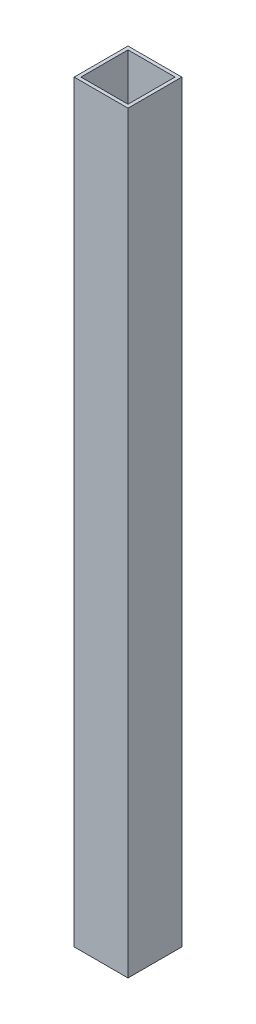
ISO-10303-21;
HEADER;
FILE_DESCRIPTION(('STEP AP214'),'2;1');
FILE_NAME('part.step','',(''),(''),'','','');
FILE_SCHEMA(('AUTOMOTIVE_DESIGN { 1 0 10303 214 1 1 1 1 }'));
ENDSEC;
DATA;
#1=APPLICATION_CONTEXT('core data for automotive mechanical design processes');
#2=APPLICATION_PROTOCOL_DEFINITION('international standard','automotive_design',2000,#1);
#3=PRODUCT_CONTEXT('',#1,'mechanical');
#4=PRODUCT('Part','Part','',(#3));
#5=PRODUCT_RELATED_PRODUCT_CATEGORY('part','',(#4));
#6=PRODUCT_DEFINITION_FORMATION('','',#4);
#7=PRODUCT_DEFINITION_CONTEXT('part definition',#1,'design');
#8=PRODUCT_DEFINITION('design','',#6,#7);
#9=PRODUCT_DEFINITION_SHAPE('','',#8);
#10=(LENGTH_UNIT() NAMED_UNIT(*) SI_UNIT(.MILLI.,.METRE.));
#11=(NAMED_UNIT(*) PLANE_ANGLE_UNIT() SI_UNIT($,.RADIAN.));
#12=(NAMED_UNIT(*) SI_UNIT($,.STERADIAN.) SOLID_ANGLE_UNIT());
#13=UNCERTAINTY_MEASURE_WITH_UNIT(LENGTH_MEASURE(1.E-05),#10,'distance_accuracy_value','');
#14=(GEOMETRIC_REPRESENTATION_CONTEXT(3) GLOBAL_UNCERTAINTY_ASSIGNED_CONTEXT((#13)) GLOBAL_UNIT_ASSIGNED_CONTEXT((#10,
#11,#12)) REPRESENTATION_CONTEXT('',''));
#15=CARTESIAN_POINT('',(0.,0.,0.));
#16=DIRECTION('',(0.,0.,1.));
#17=DIRECTION('',(1.,0.,0.));
#18=AXIS2_PLACEMENT_3D('',#15,#16,#17);
#19=CARTESIAN_POINT('',(0.,355.6,0.));
#20=DIRECTION('',(0.,-1.,0.));
#21=DIRECTION('',(0.,0.,-1.));
#22=AXIS2_PLACEMENT_3D('',#19,#20,#21);
#23=PLANE('',#22);
#24=DIRECTION('',(0.,0.,-1.));
#25=VECTOR('',#24,1.);
#26=CARTESIAN_POINT('',(12.7,355.6,12.7));
#27=LINE('',#26,#25);
#28=CARTESIAN_POINT('',(12.7,355.6,12.7));
#29=VERTEX_POINT('',#28);
#30=CARTESIAN_POINT('',(12.7,355.6,-12.7));
#31=VERTEX_POINT('',#30);
#32=EDGE_CURVE('E134',#29,#31,#27,.T.);
#33=ORIENTED_EDGE('',*,*,#32,.T.);
#34=DIRECTION('',(-1.,0.,0.));
#35=VECTOR('',#34,1.);
#36=CARTESIAN_POINT('',(-12.7,355.6,-12.7));
#37=LINE('',#36,#35);
#38=CARTESIAN_POINT('',(-12.7,355.6,-12.7));
#39=VERTEX_POINT('',#38);
#40=EDGE_CURVE('E137',#31,#39,#37,.T.);
#41=ORIENTED_EDGE('',*,*,#40,.T.);
#42=DIRECTION('',(0.,0.,1.));
#43=VECTOR('',#42,1.);
#44=CARTESIAN_POINT('',(-12.7,355.6,12.7));
#45=LINE('',#44,#43);
#46=CARTESIAN_POINT('',(-12.7,355.6,12.7));
#47=VERTEX_POINT('',#46);
#48=EDGE_CURVE('E140',#39,#47,#45,.T.);
#49=ORIENTED_EDGE('',*,*,#48,.T.);
#50=DIRECTION('',(1.,0.,0.));
#51=VECTOR('',#50,1.);
#52=CARTESIAN_POINT('',(-12.7,355.6,12.7));
#53=LINE('',#52,#51);
#54=EDGE_CURVE('E142',#47,#29,#53,.T.);
#55=ORIENTED_EDGE('',*,*,#54,.T.);
#56=EDGE_LOOP('',(#33,#41,#49,#55));
#57=FACE_BOUND('',#56,.T.);
#58=DIRECTION('',(0.,0.,-1.));
#59=VECTOR('',#58,1.);
#60=CARTESIAN_POINT('',(11.1125,355.6,11.1125));
#61=LINE('',#60,#59);
#62=CARTESIAN_POINT('',(11.1125,355.6,11.1125));
#63=VERTEX_POINT('',#62);
#64=CARTESIAN_POINT('',(11.1125,355.6,-11.1125));
#65=VERTEX_POINT('',#64);
#66=EDGE_CURVE('E98',#63,#65,#61,.T.);
#67=ORIENTED_EDGE('',*,*,#66,.F.);
#68=DIRECTION('',(1.,0.,0.));
#69=VECTOR('',#68,1.);
#70=CARTESIAN_POINT('',(-11.1125,355.6,11.1125));
#71=LINE('',#70,#69);
#72=CARTESIAN_POINT('',(-11.1125,355.6,11.1125));
#73=VERTEX_POINT('',#72);
#74=EDGE_CURVE('E120',#73,#63,#71,.T.);
#75=ORIENTED_EDGE('',*,*,#74,.F.);
#76=DIRECTION('',(0.,0.,1.));
#77=VECTOR('',#76,1.);
#78=CARTESIAN_POINT('',(-11.1125,355.6,11.1125));
#79=LINE('',#78,#77);
#80=CARTESIAN_POINT('',(-11.1125,355.6,-11.1125));
#81=VERTEX_POINT('',#80);
#82=EDGE_CURVE('E118',#81,#73,#79,.T.);
#83=ORIENTED_EDGE('',*,*,#82,.F.);
#84=DIRECTION('',(-1.,0.,0.));
#85=VECTOR('',#84,1.);
#86=CARTESIAN_POINT('',(-11.1125,355.6,-11.1125));
#87=LINE('',#86,#85);
#88=EDGE_CURVE('E106',#65,#81,#87,.T.);
#89=ORIENTED_EDGE('',*,*,#88,.F.);
#90=EDGE_LOOP('',(#67,#75,#83,#89));
#91=FACE_BOUND('',#90,.T.);
#92=ADVANCED_FACE('F33',(#57,#91),#23,.F.);
#93=CARTESIAN_POINT('',(0.,0.,0.));
#94=DIRECTION('',(0.,-1.,0.));
#95=DIRECTION('',(0.,0.,-1.));
#96=AXIS2_PLACEMENT_3D('',#93,#94,#95);
#97=PLANE('',#96);
#98=DIRECTION('',(0.,0.,-1.));
#99=VECTOR('',#98,1.);
#100=CARTESIAN_POINT('',(12.7,0.,12.7));
#101=LINE('',#100,#99);
#102=CARTESIAN_POINT('',(12.7,0.,12.7));
#103=VERTEX_POINT('',#102);
#104=CARTESIAN_POINT('',(12.7,0.,-12.7));
#105=VERTEX_POINT('',#104);
#106=EDGE_CURVE('E114',#103,#105,#101,.T.);
#107=ORIENTED_EDGE('',*,*,#106,.F.);
#108=DIRECTION('',(1.,0.,0.));
#109=VECTOR('',#108,1.);
#110=CARTESIAN_POINT('',(-12.7,0.,12.7));
#111=LINE('',#110,#109);
#112=CARTESIAN_POINT('',(-12.7,0.,12.7));
#113=VERTEX_POINT('',#112);
#114=EDGE_CURVE('E138',#113,#103,#111,.T.);
#115=ORIENTED_EDGE('',*,*,#114,.F.);
#116=DIRECTION('',(0.,0.,1.));
#117=VECTOR('',#116,1.);
#118=CARTESIAN_POINT('',(-12.7,0.,12.7));
#119=LINE('',#118,#117);
#120=CARTESIAN_POINT('',(-12.7,0.,-12.7));
#121=VERTEX_POINT('',#120);
#122=EDGE_CURVE('E149',#121,#113,#119,.T.);
#123=ORIENTED_EDGE('',*,*,#122,.F.);
#124=DIRECTION('',(-1.,0.,0.));
#125=VECTOR('',#124,1.);
#126=CARTESIAN_POINT('',(-12.7,0.,-12.7));
#127=LINE('',#126,#125);
#128=EDGE_CURVE('E147',#105,#121,#127,.T.);
#129=ORIENTED_EDGE('',*,*,#128,.F.);
#130=EDGE_LOOP('',(#107,#115,#123,#129));
#131=FACE_BOUND('',#130,.T.);
#132=DIRECTION('',(1.,0.,0.));
#133=VECTOR('',#132,1.);
#134=CARTESIAN_POINT('',(-11.1125,0.,11.1125));
#135=LINE('',#134,#133);
#136=CARTESIAN_POINT('',(-11.1125,0.,11.1125));
#137=VERTEX_POINT('',#136);
#138=CARTESIAN_POINT('',(11.1125,0.,11.1125));
#139=VERTEX_POINT('',#138);
#140=EDGE_CURVE('E107',#137,#139,#135,.T.);
#141=ORIENTED_EDGE('',*,*,#140,.T.);
#142=DIRECTION('',(0.,0.,-1.));
#143=VECTOR('',#142,1.);
#144=CARTESIAN_POINT('',(11.1125,0.,11.1125));
#145=LINE('',#144,#143);
#146=CARTESIAN_POINT('',(11.1125,0.,-11.1125));
#147=VERTEX_POINT('',#146);
#148=EDGE_CURVE('E56',#139,#147,#145,.T.);
#149=ORIENTED_EDGE('',*,*,#148,.T.);
#150=DIRECTION('',(-1.,0.,0.));
#151=VECTOR('',#150,1.);
#152=CARTESIAN_POINT('',(-11.1125,0.,-11.1125));
#153=LINE('',#152,#151);
#154=CARTESIAN_POINT('',(-11.1125,0.,-11.1125));
#155=VERTEX_POINT('',#154);
#156=EDGE_CURVE('E113',#147,#155,#153,.T.);
#157=ORIENTED_EDGE('',*,*,#156,.T.);
#158=DIRECTION('',(0.,0.,1.));
#159=VECTOR('',#158,1.);
#160=CARTESIAN_POINT('',(-11.1125,0.,11.1125));
#161=LINE('',#160,#159);
#162=EDGE_CURVE('E126',#155,#137,#161,.T.);
#163=ORIENTED_EDGE('',*,*,#162,.T.);
#164=EDGE_LOOP('',(#141,#149,#157,#163));
#165=FACE_BOUND('',#164,.T.);
#166=ADVANCED_FACE('F167',(#131,#165),#97,.T.);
#167=CARTESIAN_POINT('',(12.7,355.6,12.7));
#168=DIRECTION('',(-1.,0.,0.));
#169=DIRECTION('',(0.,0.,1.));
#170=AXIS2_PLACEMENT_3D('',#167,#168,#169);
#171=PLANE('',#170);
#172=ORIENTED_EDGE('',*,*,#106,.T.);
#173=DIRECTION('',(0.,-1.,0.));
#174=VECTOR('',#173,1.);
#175=CARTESIAN_POINT('',(12.7,355.6,-12.7));
#176=LINE('',#175,#174);
#177=EDGE_CURVE('E11',#31,#105,#176,.T.);
#178=ORIENTED_EDGE('',*,*,#177,.F.);
#179=ORIENTED_EDGE('',*,*,#32,.F.);
#180=DIRECTION('',(0.,-1.,0.));
#181=VECTOR('',#180,1.);
#182=CARTESIAN_POINT('',(12.7,355.6,12.7));
#183=LINE('',#182,#181);
#184=EDGE_CURVE('E144',#29,#103,#183,.T.);
#185=ORIENTED_EDGE('',*,*,#184,.T.);
#186=EDGE_LOOP('',(#172,#178,#179,#185));
#187=FACE_BOUND('',#186,.T.);
#188=ADVANCED_FACE('F35',(#187),#171,.F.);
#189=CARTESIAN_POINT('',(-12.7,355.6,-12.7));
#190=DIRECTION('',(0.,0.,1.));
#191=DIRECTION('',(1.,0.,0.));
#192=AXIS2_PLACEMENT_3D('',#189,#190,#191);
#193=PLANE('',#192);
#194=ORIENTED_EDGE('',*,*,#128,.T.);
#195=DIRECTION('',(0.,-1.,0.));
#196=VECTOR('',#195,1.);
#197=CARTESIAN_POINT('',(-12.7,355.6,-12.7));
#198=LINE('',#197,#196);
#199=EDGE_CURVE('E41',#39,#121,#198,.T.);
#200=ORIENTED_EDGE('',*,*,#199,.F.);
#201=ORIENTED_EDGE('',*,*,#40,.F.);
#202=ORIENTED_EDGE('',*,*,#177,.T.);
#203=EDGE_LOOP('',(#194,#200,#201,#202));
#204=FACE_BOUND('',#203,.T.);
#205=ADVANCED_FACE('F177',(#204),#193,.F.);
#206=CARTESIAN_POINT('',(-12.7,355.6,12.7));
#207=DIRECTION('',(1.,0.,0.));
#208=DIRECTION('',(0.,0.,-1.));
#209=AXIS2_PLACEMENT_3D('',#206,#207,#208);
#210=PLANE('',#209);
#211=ORIENTED_EDGE('',*,*,#122,.T.);
#212=DIRECTION('',(0.,-1.,0.));
#213=VECTOR('',#212,1.);
#214=CARTESIAN_POINT('',(-12.7,355.6,12.7));
#215=LINE('',#214,#213);
#216=EDGE_CURVE('E154',#47,#113,#215,.T.);
#217=ORIENTED_EDGE('',*,*,#216,.F.);
#218=ORIENTED_EDGE('',*,*,#48,.F.);
#219=ORIENTED_EDGE('',*,*,#199,.T.);
#220=EDGE_LOOP('',(#211,#217,#218,#219));
#221=FACE_BOUND('',#220,.T.);
#222=ADVANCED_FACE('F161',(#221),#210,.F.);
#223=CARTESIAN_POINT('',(-12.7,355.6,12.7));
#224=DIRECTION('',(0.,0.,-1.));
#225=DIRECTION('',(-1.,0.,0.));
#226=AXIS2_PLACEMENT_3D('',#223,#224,#225);
#227=PLANE('',#226);
#228=ORIENTED_EDGE('',*,*,#114,.T.);
#229=ORIENTED_EDGE('',*,*,#184,.F.);
#230=ORIENTED_EDGE('',*,*,#54,.F.);
#231=ORIENTED_EDGE('',*,*,#216,.T.);
#232=EDGE_LOOP('',(#228,#229,#230,#231));
#233=FACE_BOUND('',#232,.T.);
#234=ADVANCED_FACE('F171',(#233),#227,.F.);
#235=CARTESIAN_POINT('',(11.1125,355.6,11.1125));
#236=DIRECTION('',(-1.,0.,0.));
#237=DIRECTION('',(0.,0.,1.));
#238=AXIS2_PLACEMENT_3D('',#235,#236,#237);
#239=PLANE('',#238);
#240=ORIENTED_EDGE('',*,*,#148,.F.);
#241=DIRECTION('',(0.,-1.,0.));
#242=VECTOR('',#241,1.);
#243=CARTESIAN_POINT('',(11.1125,355.6,11.1125));
#244=LINE('',#243,#242);
#245=EDGE_CURVE('E102',#63,#139,#244,.T.);
#246=ORIENTED_EDGE('',*,*,#245,.F.);
#247=ORIENTED_EDGE('',*,*,#66,.T.);
#248=DIRECTION('',(0.,-1.,0.));
#249=VECTOR('',#248,1.);
#250=CARTESIAN_POINT('',(11.1125,355.6,-11.1125));
#251=LINE('',#250,#249);
#252=EDGE_CURVE('E101',#65,#147,#251,.T.);
#253=ORIENTED_EDGE('',*,*,#252,.T.);
#254=EDGE_LOOP('',(#240,#246,#247,#253));
#255=FACE_BOUND('',#254,.T.);
#256=ADVANCED_FACE('F100',(#255),#239,.T.);
#257=CARTESIAN_POINT('',(-11.1125,355.6,-11.1125));
#258=DIRECTION('',(0.,0.,1.));
#259=DIRECTION('',(1.,0.,0.));
#260=AXIS2_PLACEMENT_3D('',#257,#258,#259);
#261=PLANE('',#260);
#262=ORIENTED_EDGE('',*,*,#156,.F.);
#263=ORIENTED_EDGE('',*,*,#252,.F.);
#264=ORIENTED_EDGE('',*,*,#88,.T.);
#265=DIRECTION('',(0.,-1.,0.));
#266=VECTOR('',#265,1.);
#267=CARTESIAN_POINT('',(-11.1125,355.6,-11.1125));
#268=LINE('',#267,#266);
#269=EDGE_CURVE('E115',#81,#155,#268,.T.);
#270=ORIENTED_EDGE('',*,*,#269,.T.);
#271=EDGE_LOOP('',(#262,#263,#264,#270));
#272=FACE_BOUND('',#271,.T.);
#273=ADVANCED_FACE('F110',(#272),#261,.T.);
#274=CARTESIAN_POINT('',(-11.1125,355.6,11.1125));
#275=DIRECTION('',(1.,0.,0.));
#276=DIRECTION('',(0.,0.,-1.));
#277=AXIS2_PLACEMENT_3D('',#274,#275,#276);
#278=PLANE('',#277);
#279=ORIENTED_EDGE('',*,*,#162,.F.);
#280=ORIENTED_EDGE('',*,*,#269,.F.);
#281=ORIENTED_EDGE('',*,*,#82,.T.);
#282=DIRECTION('',(0.,-1.,0.));
#283=VECTOR('',#282,1.);
#284=CARTESIAN_POINT('',(-11.1125,355.6,11.1125));
#285=LINE('',#284,#283);
#286=EDGE_CURVE('E48',#73,#137,#285,.T.);
#287=ORIENTED_EDGE('',*,*,#286,.T.);
#288=EDGE_LOOP('',(#279,#280,#281,#287));
#289=FACE_BOUND('',#288,.T.);
#290=ADVANCED_FACE('F200',(#289),#278,.T.);
#291=CARTESIAN_POINT('',(-11.1125,355.6,11.1125));
#292=DIRECTION('',(0.,0.,-1.));
#293=DIRECTION('',(-1.,0.,0.));
#294=AXIS2_PLACEMENT_3D('',#291,#292,#293);
#295=PLANE('',#294);
#296=ORIENTED_EDGE('',*,*,#140,.F.);
#297=ORIENTED_EDGE('',*,*,#286,.F.);
#298=ORIENTED_EDGE('',*,*,#74,.T.);
#299=ORIENTED_EDGE('',*,*,#245,.T.);
#300=EDGE_LOOP('',(#296,#297,#298,#299));
#301=FACE_BOUND('',#300,.T.);
#302=ADVANCED_FACE('F204',(#301),#295,.T.);
#303=CLOSED_SHELL('',(#92,#166,#188,#205,#222,#234,#256,#273,#290,#302));
#304=MANIFOLD_SOLID_BREP('B2',#303);
#305=ADVANCED_BREP_SHAPE_REPRESENTATION('',(#18,#304),#14);
#306=SHAPE_DEFINITION_REPRESENTATION(#9,#305);
ENDSEC;
END-ISO-10303-21;
